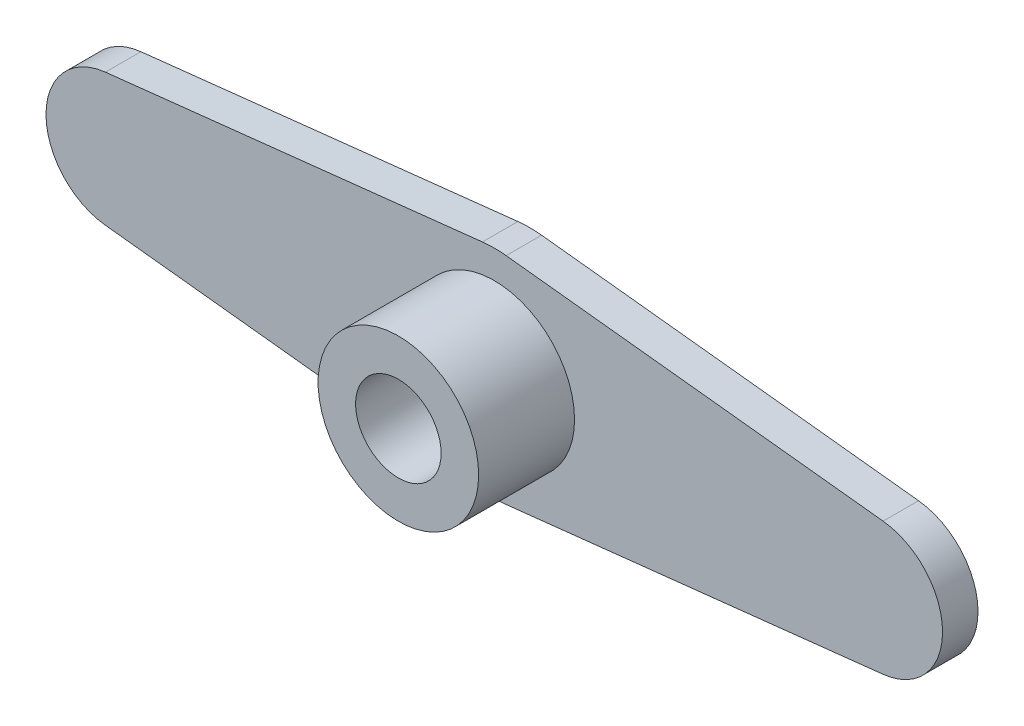
ISO-10303-21;
HEADER;
FILE_DESCRIPTION(('STEP AP214'),'2;1');
FILE_NAME('part.step','',(''),(''),'','','');
FILE_SCHEMA(('AUTOMOTIVE_DESIGN { 1 0 10303 214 1 1 1 1 }'));
ENDSEC;
DATA;
#1=APPLICATION_CONTEXT('core data for automotive mechanical design processes');
#2=APPLICATION_PROTOCOL_DEFINITION('international standard','automotive_design',2000,#1);
#3=PRODUCT_CONTEXT('',#1,'mechanical');
#4=PRODUCT('Part','Part','',(#3));
#5=PRODUCT_RELATED_PRODUCT_CATEGORY('part','',(#4));
#6=PRODUCT_DEFINITION_FORMATION('','',#4);
#7=PRODUCT_DEFINITION_CONTEXT('part definition',#1,'design');
#8=PRODUCT_DEFINITION('design','',#6,#7);
#9=PRODUCT_DEFINITION_SHAPE('','',#8);
#10=(LENGTH_UNIT() NAMED_UNIT(*) SI_UNIT(.MILLI.,.METRE.));
#11=(NAMED_UNIT(*) PLANE_ANGLE_UNIT() SI_UNIT($,.RADIAN.));
#12=(NAMED_UNIT(*) SI_UNIT($,.STERADIAN.) SOLID_ANGLE_UNIT());
#13=UNCERTAINTY_MEASURE_WITH_UNIT(LENGTH_MEASURE(1.E-05),#10,'distance_accuracy_value','');
#14=(GEOMETRIC_REPRESENTATION_CONTEXT(3) GLOBAL_UNCERTAINTY_ASSIGNED_CONTEXT((#13)) GLOBAL_UNIT_ASSIGNED_CONTEXT((#10,
#11,#12)) REPRESENTATION_CONTEXT('',''));
#15=CARTESIAN_POINT('',(0.,0.,0.));
#16=DIRECTION('',(0.,0.,1.));
#17=DIRECTION('',(1.,0.,0.));
#18=AXIS2_PLACEMENT_3D('',#15,#16,#17);
#19=CARTESIAN_POINT('',(-23.241,0.,2.159));
#20=DIRECTION('',(0.,0.,-1.));
#21=DIRECTION('',(-1.,0.,0.));
#22=AXIS2_PLACEMENT_3D('',#19,#20,#21);
#23=CYLINDRICAL_SURFACE('',#22,4.064);
#24=CARTESIAN_POINT('',(-23.241,0.,0.));
#25=DIRECTION('',(0.,0.,1.));
#26=DIRECTION('',(1.,0.,0.));
#27=AXIS2_PLACEMENT_3D('',#24,#25,#26);
#28=CIRCLE('',#27,4.064);
#29=CARTESIAN_POINT('',(-23.6851530054645,4.03965643436875,0.));
#30=VERTEX_POINT('',#29);
#31=CARTESIAN_POINT('',(-23.6851530054645,-4.03965643436875,0.));
#32=VERTEX_POINT('',#31);
#33=EDGE_CURVE('E138',#30,#32,#28,.T.);
#34=ORIENTED_EDGE('',*,*,#33,.T.);
#35=DIRECTION('',(0.,0.,-1.));
#36=VECTOR('',#35,1.);
#37=CARTESIAN_POINT('',(-23.6851530054645,-4.03965643436875,2.159));
#38=LINE('',#37,#36);
#39=CARTESIAN_POINT('',(-23.6851530054645,-4.03965643436875,2.159));
#40=VERTEX_POINT('',#39);
#41=EDGE_CURVE('E46',#40,#32,#38,.T.);
#42=ORIENTED_EDGE('',*,*,#41,.F.);
#43=CARTESIAN_POINT('',(-23.241,0.,2.159));
#44=DIRECTION('',(0.,0.,1.));
#45=DIRECTION('',(1.,0.,0.));
#46=AXIS2_PLACEMENT_3D('',#43,#44,#45);
#47=CIRCLE('',#46,4.064);
#48=CARTESIAN_POINT('',(-23.6851530054645,4.03965643436875,2.159));
#49=VERTEX_POINT('',#48);
#50=EDGE_CURVE('E158',#49,#40,#47,.T.);
#51=ORIENTED_EDGE('',*,*,#50,.F.);
#52=DIRECTION('',(0.,0.,-1.));
#53=VECTOR('',#52,1.);
#54=CARTESIAN_POINT('',(-23.6851530054645,4.03965643436875,2.159));
#55=LINE('',#54,#53);
#56=EDGE_CURVE('E54',#49,#30,#55,.T.);
#57=ORIENTED_EDGE('',*,*,#56,.T.);
#58=EDGE_LOOP('',(#34,#42,#51,#57));
#59=FACE_BOUND('',#58,.T.);
#60=ADVANCED_FACE('F38',(#59),#23,.T.);
#61=CARTESIAN_POINT('',(-23.6851530054645,-4.03965643436875,2.159));
#62=DIRECTION('',(0.109289617486339,0.99400994940176,0.));
#63=DIRECTION('',(-0.99400994940176,0.109289617486339,0.));
#64=AXIS2_PLACEMENT_3D('',#61,#62,#63);
#65=PLANE('',#64);
#66=DIRECTION('',(0.99400994940176,-0.109289617486339,0.));
#67=VECTOR('',#66,1.);
#68=CARTESIAN_POINT('',(-23.6851530054645,-4.03965643436875,0.));
#69=LINE('',#68,#67);
#70=CARTESIAN_POINT('',(-0.72174863387978,-6.56444170584923,0.));
#71=VERTEX_POINT('',#70);
#72=EDGE_CURVE('E140',#32,#71,#69,.T.);
#73=ORIENTED_EDGE('',*,*,#72,.T.);
#74=DIRECTION('',(0.,0.,-1.));
#75=VECTOR('',#74,1.);
#76=CARTESIAN_POINT('',(-0.72174863387978,-6.56444170584923,2.159));
#77=LINE('',#76,#75);
#78=CARTESIAN_POINT('',(-0.72174863387978,-6.56444170584923,2.159));
#79=VERTEX_POINT('',#78);
#80=EDGE_CURVE('E166',#79,#71,#77,.T.);
#81=ORIENTED_EDGE('',*,*,#80,.F.);
#82=DIRECTION('',(0.99400994940176,-0.109289617486339,0.));
#83=VECTOR('',#82,1.);
#84=CARTESIAN_POINT('',(-23.6851530054645,-4.03965643436875,2.159));
#85=LINE('',#84,#83);
#86=EDGE_CURVE('E94',#40,#79,#85,.T.);
#87=ORIENTED_EDGE('',*,*,#86,.F.);
#88=ORIENTED_EDGE('',*,*,#41,.T.);
#89=EDGE_LOOP('',(#73,#81,#87,#88));
#90=FACE_BOUND('',#89,.T.);
#91=ADVANCED_FACE('F169',(#90),#65,.F.);
#92=CARTESIAN_POINT('',(0.,0.,2.159));
#93=DIRECTION('',(0.,0.,-1.));
#94=DIRECTION('',(-1.,0.,0.));
#95=AXIS2_PLACEMENT_3D('',#92,#93,#94);
#96=CYLINDRICAL_SURFACE('',#95,6.604);
#97=CARTESIAN_POINT('',(0.,0.,0.));
#98=DIRECTION('',(0.,0.,1.));
#99=DIRECTION('',(1.,0.,0.));
#100=AXIS2_PLACEMENT_3D('',#97,#98,#99);
#101=CIRCLE('',#100,6.604);
#102=CARTESIAN_POINT('',(0.721748633879781,-6.56444170584923,0.));
#103=VERTEX_POINT('',#102);
#104=EDGE_CURVE('E143',#71,#103,#101,.T.);
#105=ORIENTED_EDGE('',*,*,#104,.T.);
#106=DIRECTION('',(0.,0.,-1.));
#107=VECTOR('',#106,1.);
#108=CARTESIAN_POINT('',(0.721748633879781,-6.56444170584923,2.159));
#109=LINE('',#108,#107);
#110=CARTESIAN_POINT('',(0.721748633879781,-6.56444170584923,2.159));
#111=VERTEX_POINT('',#110);
#112=EDGE_CURVE('E164',#111,#103,#109,.T.);
#113=ORIENTED_EDGE('',*,*,#112,.F.);
#114=CARTESIAN_POINT('',(0.,0.,2.159));
#115=DIRECTION('',(0.,0.,1.));
#116=DIRECTION('',(1.,0.,0.));
#117=AXIS2_PLACEMENT_3D('',#114,#115,#116);
#118=CIRCLE('',#117,6.604);
#119=EDGE_CURVE('E341',#79,#111,#118,.T.);
#120=ORIENTED_EDGE('',*,*,#119,.F.);
#121=ORIENTED_EDGE('',*,*,#80,.T.);
#122=EDGE_LOOP('',(#105,#113,#120,#121));
#123=FACE_BOUND('',#122,.T.);
#124=ADVANCED_FACE('F189',(#123),#96,.T.);
#125=CARTESIAN_POINT('',(23.6851530054645,-4.03965643436875,2.159));
#126=DIRECTION('',(0.109289617486339,-0.99400994940176,0.));
#127=DIRECTION('',(0.99400994940176,0.109289617486339,0.));
#128=AXIS2_PLACEMENT_3D('',#125,#126,#127);
#129=PLANE('',#128);
#130=DIRECTION('',(-0.99400994940176,-0.109289617486339,0.));
#131=VECTOR('',#130,1.);
#132=CARTESIAN_POINT('',(23.6851530054645,-4.03965643436875,0.));
#133=LINE('',#132,#131);
#134=CARTESIAN_POINT('',(23.6851530054645,-4.03965643436875,0.));
#135=VERTEX_POINT('',#134);
#136=EDGE_CURVE('E146',#135,#103,#133,.T.);
#137=ORIENTED_EDGE('',*,*,#136,.F.);
#138=DIRECTION('',(0.,0.,-1.));
#139=VECTOR('',#138,1.);
#140=CARTESIAN_POINT('',(23.6851530054645,-4.03965643436875,2.159));
#141=LINE('',#140,#139);
#142=CARTESIAN_POINT('',(23.6851530054645,-4.03965643436875,2.159));
#143=VERTEX_POINT('',#142);
#144=EDGE_CURVE('E162',#143,#135,#141,.T.);
#145=ORIENTED_EDGE('',*,*,#144,.F.);
#146=DIRECTION('',(-0.99400994940176,-0.109289617486339,0.));
#147=VECTOR('',#146,1.);
#148=CARTESIAN_POINT('',(23.6851530054645,-4.03965643436875,2.159));
#149=LINE('',#148,#147);
#150=EDGE_CURVE('E133',#143,#111,#149,.T.);
#151=ORIENTED_EDGE('',*,*,#150,.T.);
#152=ORIENTED_EDGE('',*,*,#112,.T.);
#153=EDGE_LOOP('',(#137,#145,#151,#152));
#154=FACE_BOUND('',#153,.T.);
#155=ADVANCED_FACE('F193',(#154),#129,.T.);
#156=CARTESIAN_POINT('',(23.241,0.,2.159));
#157=DIRECTION('',(0.,0.,-1.));
#158=DIRECTION('',(-1.,0.,0.));
#159=AXIS2_PLACEMENT_3D('',#156,#157,#158);
#160=CYLINDRICAL_SURFACE('',#159,4.064);
#161=CARTESIAN_POINT('',(23.241,0.,0.));
#162=DIRECTION('',(0.,0.,1.));
#163=DIRECTION('',(1.,0.,0.));
#164=AXIS2_PLACEMENT_3D('',#161,#162,#163);
#165=CIRCLE('',#164,4.064);
#166=CARTESIAN_POINT('',(23.6851530054645,4.03965643436875,0.));
#167=VERTEX_POINT('',#166);
#168=EDGE_CURVE('E149',#135,#167,#165,.T.);
#169=ORIENTED_EDGE('',*,*,#168,.T.);
#170=DIRECTION('',(0.,0.,-1.));
#171=VECTOR('',#170,1.);
#172=CARTESIAN_POINT('',(23.6851530054645,4.03965643436875,2.159));
#173=LINE('',#172,#171);
#174=CARTESIAN_POINT('',(23.6851530054645,4.03965643436875,2.159));
#175=VERTEX_POINT('',#174);
#176=EDGE_CURVE('E119',#175,#167,#173,.T.);
#177=ORIENTED_EDGE('',*,*,#176,.F.);
#178=CARTESIAN_POINT('',(23.241,0.,2.159));
#179=DIRECTION('',(0.,0.,1.));
#180=DIRECTION('',(1.,0.,0.));
#181=AXIS2_PLACEMENT_3D('',#178,#179,#180);
#182=CIRCLE('',#181,4.064);
#183=EDGE_CURVE('E130',#143,#175,#182,.T.);
#184=ORIENTED_EDGE('',*,*,#183,.F.);
#185=ORIENTED_EDGE('',*,*,#144,.T.);
#186=EDGE_LOOP('',(#169,#177,#184,#185));
#187=FACE_BOUND('',#186,.T.);
#188=ADVANCED_FACE('F199',(#187),#160,.T.);
#189=CARTESIAN_POINT('',(0.721748633879781,6.56444170584923,2.159));
#190=DIRECTION('',(0.109289617486339,0.99400994940176,0.));
#191=DIRECTION('',(-0.99400994940176,0.109289617486339,0.));
#192=AXIS2_PLACEMENT_3D('',#189,#190,#191);
#193=PLANE('',#192);
#194=DIRECTION('',(0.99400994940176,-0.109289617486339,0.));
#195=VECTOR('',#194,1.);
#196=CARTESIAN_POINT('',(0.721748633879781,6.56444170584923,0.));
#197=LINE('',#196,#195);
#198=CARTESIAN_POINT('',(0.721748633879781,6.56444170584923,0.));
#199=VERTEX_POINT('',#198);
#200=EDGE_CURVE('E116',#199,#167,#197,.T.);
#201=ORIENTED_EDGE('',*,*,#200,.F.);
#202=DIRECTION('',(0.,0.,-1.));
#203=VECTOR('',#202,1.);
#204=CARTESIAN_POINT('',(0.721748633879781,6.56444170584923,2.159));
#205=LINE('',#204,#203);
#206=CARTESIAN_POINT('',(0.721748633879781,6.56444170584923,2.159));
#207=VERTEX_POINT('',#206);
#208=EDGE_CURVE('E110',#207,#199,#205,.T.);
#209=ORIENTED_EDGE('',*,*,#208,.F.);
#210=DIRECTION('',(0.99400994940176,-0.109289617486339,0.));
#211=VECTOR('',#210,1.);
#212=CARTESIAN_POINT('',(0.721748633879781,6.56444170584923,2.159));
#213=LINE('',#212,#211);
#214=EDGE_CURVE('E114',#207,#175,#213,.T.);
#215=ORIENTED_EDGE('',*,*,#214,.T.);
#216=ORIENTED_EDGE('',*,*,#176,.T.);
#217=EDGE_LOOP('',(#201,#209,#215,#216));
#218=FACE_BOUND('',#217,.T.);
#219=ADVANCED_FACE('F112',(#218),#193,.T.);
#220=CARTESIAN_POINT('',(0.,0.,2.159));
#221=DIRECTION('',(0.,0.,-1.));
#222=DIRECTION('',(-1.,0.,0.));
#223=AXIS2_PLACEMENT_3D('',#220,#221,#222);
#224=CYLINDRICAL_SURFACE('',#223,6.604);
#225=CARTESIAN_POINT('',(0.,0.,0.));
#226=DIRECTION('',(0.,0.,1.));
#227=DIRECTION('',(1.,0.,0.));
#228=AXIS2_PLACEMENT_3D('',#225,#226,#227);
#229=CIRCLE('',#228,6.604);
#230=CARTESIAN_POINT('',(-0.721748633879781,6.56444170584923,0.));
#231=VERTEX_POINT('',#230);
#232=EDGE_CURVE('E153',#199,#231,#229,.T.);
#233=ORIENTED_EDGE('',*,*,#232,.T.);
#234=DIRECTION('',(0.,0.,-1.));
#235=VECTOR('',#234,1.);
#236=CARTESIAN_POINT('',(-0.721748633879781,6.56444170584923,2.159));
#237=LINE('',#236,#235);
#238=CARTESIAN_POINT('',(-0.721748633879781,6.56444170584923,2.159));
#239=VERTEX_POINT('',#238);
#240=EDGE_CURVE('E81',#239,#231,#237,.T.);
#241=ORIENTED_EDGE('',*,*,#240,.F.);
#242=CARTESIAN_POINT('',(0.,0.,2.159));
#243=DIRECTION('',(0.,0.,1.));
#244=DIRECTION('',(1.,0.,0.));
#245=AXIS2_PLACEMENT_3D('',#242,#243,#244);
#246=CIRCLE('',#245,6.604);
#247=EDGE_CURVE('E121',#207,#239,#246,.T.);
#248=ORIENTED_EDGE('',*,*,#247,.F.);
#249=ORIENTED_EDGE('',*,*,#208,.T.);
#250=EDGE_LOOP('',(#233,#241,#248,#249));
#251=FACE_BOUND('',#250,.T.);
#252=ADVANCED_FACE('F122',(#251),#224,.T.);
#253=CARTESIAN_POINT('',(-23.6851530054645,4.03965643436875,2.159));
#254=DIRECTION('',(-0.109289617486339,0.99400994940176,0.));
#255=DIRECTION('',(-0.99400994940176,-0.109289617486339,0.));
#256=AXIS2_PLACEMENT_3D('',#253,#254,#255);
#257=PLANE('',#256);
#258=DIRECTION('',(0.99400994940176,0.109289617486339,0.));
#259=VECTOR('',#258,1.);
#260=CARTESIAN_POINT('',(-23.6851530054645,4.03965643436875,0.));
#261=LINE('',#260,#259);
#262=EDGE_CURVE('E155',#30,#231,#261,.T.);
#263=ORIENTED_EDGE('',*,*,#262,.F.);
#264=ORIENTED_EDGE('',*,*,#56,.F.);
#265=DIRECTION('',(0.99400994940176,0.109289617486339,0.));
#266=VECTOR('',#265,1.);
#267=CARTESIAN_POINT('',(-23.6851530054645,4.03965643436875,2.159));
#268=LINE('',#267,#266);
#269=EDGE_CURVE('E125',#49,#239,#268,.T.);
#270=ORIENTED_EDGE('',*,*,#269,.T.);
#271=ORIENTED_EDGE('',*,*,#240,.T.);
#272=EDGE_LOOP('',(#263,#264,#270,#271));
#273=FACE_BOUND('',#272,.T.);
#274=ADVANCED_FACE('F173',(#273),#257,.T.);
#275=CARTESIAN_POINT('',(-23.241,0.,2.159));
#276=DIRECTION('',(0.,0.,1.));
#277=DIRECTION('',(1.,0.,0.));
#278=AXIS2_PLACEMENT_3D('',#275,#276,#277);
#279=PLANE('',#278);
#280=CARTESIAN_POINT('',(0.,0.,2.159));
#281=DIRECTION('',(0.,0.,1.));
#282=DIRECTION('',(1.,0.,0.));
#283=AXIS2_PLACEMENT_3D('',#280,#281,#282);
#284=CIRCLE('',#283,4.8895);
#285=CARTESIAN_POINT('',(4.8895,0.,2.159));
#286=VERTEX_POINT('',#285);
#287=EDGE_CURVE('E332',#286,#286,#284,.T.);
#288=ORIENTED_EDGE('',*,*,#287,.F.);
#289=EDGE_LOOP('',(#288));
#290=FACE_BOUND('',#289,.T.);
#291=ORIENTED_EDGE('',*,*,#50,.T.);
#292=ORIENTED_EDGE('',*,*,#86,.T.);
#293=ORIENTED_EDGE('',*,*,#119,.T.);
#294=ORIENTED_EDGE('',*,*,#150,.F.);
#295=ORIENTED_EDGE('',*,*,#183,.T.);
#296=ORIENTED_EDGE('',*,*,#214,.F.);
#297=ORIENTED_EDGE('',*,*,#247,.T.);
#298=ORIENTED_EDGE('',*,*,#269,.F.);
#299=EDGE_LOOP('',(#291,#292,#293,#294,#295,#296,#297,#298));
#300=FACE_BOUND('',#299,.T.);
#301=ADVANCED_FACE('F127',(#290,#300),#279,.T.);
#302=CARTESIAN_POINT('',(-23.241,0.,0.));
#303=DIRECTION('',(0.,0.,1.));
#304=DIRECTION('',(1.,0.,0.));
#305=AXIS2_PLACEMENT_3D('',#302,#303,#304);
#306=PLANE('',#305);
#307=ORIENTED_EDGE('',*,*,#33,.F.);
#308=ORIENTED_EDGE('',*,*,#262,.T.);
#309=ORIENTED_EDGE('',*,*,#232,.F.);
#310=ORIENTED_EDGE('',*,*,#200,.T.);
#311=ORIENTED_EDGE('',*,*,#168,.F.);
#312=ORIENTED_EDGE('',*,*,#136,.T.);
#313=ORIENTED_EDGE('',*,*,#104,.F.);
#314=ORIENTED_EDGE('',*,*,#72,.F.);
#315=EDGE_LOOP('',(#307,#308,#309,#310,#311,#312,#313,#314));
#316=FACE_BOUND('',#315,.T.);
#317=ADVANCED_FACE('F171',(#316),#306,.F.);
#318=CARTESIAN_POINT('',(0.,0.,8.001));
#319=DIRECTION('',(0.,0.,1.));
#320=DIRECTION('',(1.,0.,0.));
#321=AXIS2_PLACEMENT_3D('',#318,#319,#320);
#322=PLANE('',#321);
#323=CARTESIAN_POINT('',(0.,0.,8.001));
#324=DIRECTION('',(0.,0.,1.));
#325=DIRECTION('',(1.,0.,0.));
#326=AXIS2_PLACEMENT_3D('',#323,#324,#325);
#327=CIRCLE('',#326,4.8895);
#328=CARTESIAN_POINT('',(4.8895,0.,8.001));
#329=VERTEX_POINT('',#328);
#330=EDGE_CURVE('E141',#329,#329,#327,.T.);
#331=ORIENTED_EDGE('',*,*,#330,.T.);
#332=EDGE_LOOP('',(#331));
#333=FACE_BOUND('',#332,.T.);
#334=CARTESIAN_POINT('',(0.,0.,8.001));
#335=DIRECTION('',(0.,0.,1.));
#336=DIRECTION('',(1.,0.,0.));
#337=AXIS2_PLACEMENT_3D('',#334,#335,#336);
#338=CIRCLE('',#337,2.6035);
#339=CARTESIAN_POINT('',(2.6035,0.,8.001));
#340=VERTEX_POINT('',#339);
#341=EDGE_CURVE('E330',#340,#340,#338,.T.);
#342=ORIENTED_EDGE('',*,*,#341,.F.);
#343=EDGE_LOOP('',(#342));
#344=FACE_BOUND('',#343,.T.);
#345=ADVANCED_FACE('F229',(#333,#344),#322,.T.);
#346=CARTESIAN_POINT('',(0.,0.,8.001));
#347=DIRECTION('',(0.,0.,-1.));
#348=DIRECTION('',(-1.,0.,0.));
#349=AXIS2_PLACEMENT_3D('',#346,#347,#348);
#350=CYLINDRICAL_SURFACE('',#349,4.8895);
#351=ORIENTED_EDGE('',*,*,#330,.F.);
#352=EDGE_LOOP('',(#351));
#353=FACE_BOUND('',#352,.T.);
#354=ORIENTED_EDGE('',*,*,#287,.T.);
#355=EDGE_LOOP('',(#354));
#356=FACE_BOUND('',#355,.T.);
#357=ADVANCED_FACE('F245',(#353,#356),#350,.T.);
#358=CARTESIAN_POINT('',(0.,0.,8.001));
#359=DIRECTION('',(0.,0.,-1.));
#360=DIRECTION('',(-1.,0.,0.));
#361=AXIS2_PLACEMENT_3D('',#358,#359,#360);
#362=CYLINDRICAL_SURFACE('',#361,2.6035);
#363=ORIENTED_EDGE('',*,*,#341,.T.);
#364=EDGE_LOOP('',(#363));
#365=FACE_BOUND('',#364,.T.);
#366=CARTESIAN_POINT('',(0.,0.,2.159));
#367=DIRECTION('',(0.,0.,1.));
#368=DIRECTION('',(1.,0.,0.));
#369=AXIS2_PLACEMENT_3D('',#366,#367,#368);
#370=CIRCLE('',#369,2.6035);
#371=CARTESIAN_POINT('',(2.6035,0.,2.159));
#372=VERTEX_POINT('',#371);
#373=EDGE_CURVE('E11',#372,#372,#370,.F.);
#374=ORIENTED_EDGE('',*,*,#373,.T.);
#375=EDGE_LOOP('',(#374));
#376=FACE_BOUND('',#375,.T.);
#377=ADVANCED_FACE('F256',(#365,#376),#362,.F.);
#378=ORIENTED_EDGE('',*,*,#373,.F.);
#379=EDGE_LOOP('',(#378));
#380=FACE_BOUND('',#379,.T.);
#381=ADVANCED_FACE('F182',(#380),#279,.T.);
#382=CLOSED_SHELL('',(#60,#91,#124,#155,#188,#219,#252,#274,#301,#317,#345,#357,#377,#381));
#383=MANIFOLD_SOLID_BREP('B2',#382);
#384=ADVANCED_BREP_SHAPE_REPRESENTATION('',(#18,#383),#14);
#385=SHAPE_DEFINITION_REPRESENTATION(#9,#384);
ENDSEC;
END-ISO-10303-21;
